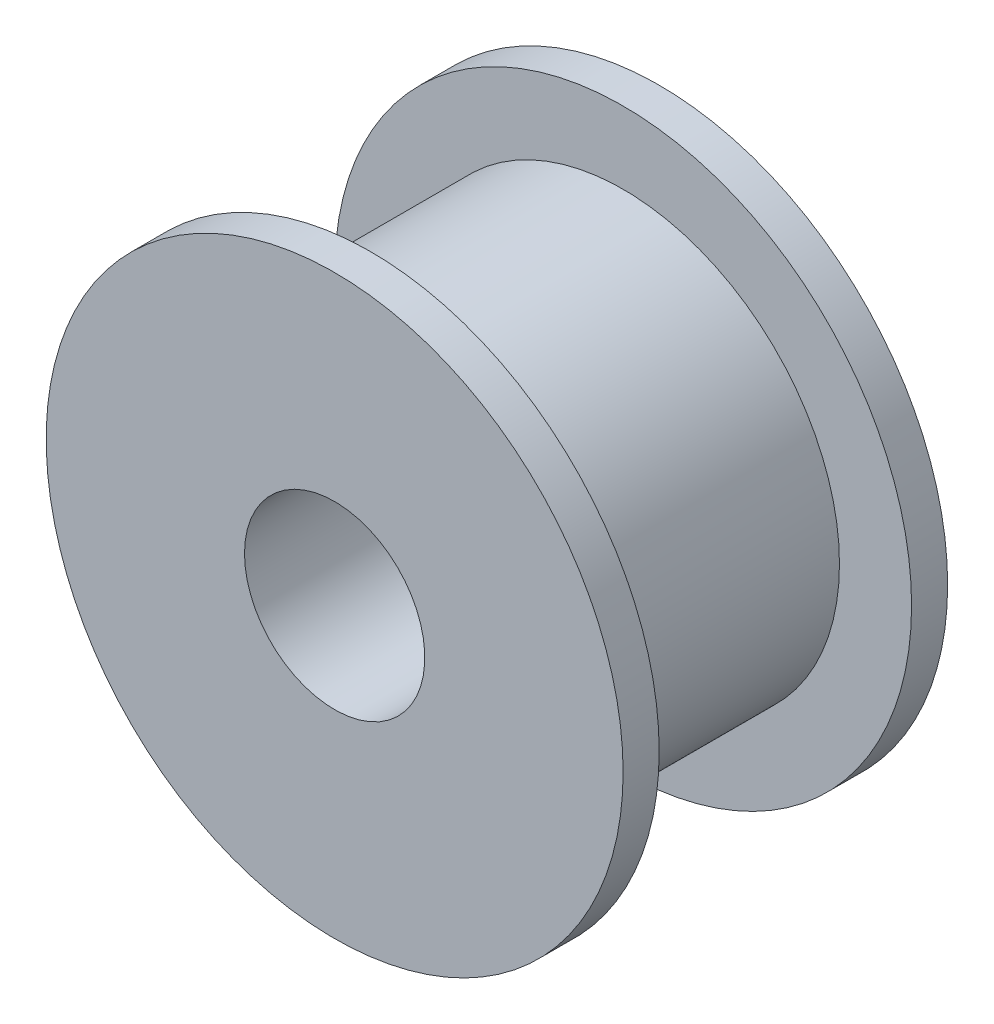
ISO-10303-21;
HEADER;
FILE_DESCRIPTION(('STEP AP214'),'2;1');
FILE_NAME('part.step','',(''),(''),'','','');
FILE_SCHEMA(('AUTOMOTIVE_DESIGN { 1 0 10303 214 1 1 1 1 }'));
ENDSEC;
DATA;
#1=APPLICATION_CONTEXT('core data for automotive mechanical design processes');
#2=APPLICATION_PROTOCOL_DEFINITION('international standard','automotive_design',2000,#1);
#3=PRODUCT_CONTEXT('',#1,'mechanical');
#4=PRODUCT('Part','Part','',(#3));
#5=PRODUCT_RELATED_PRODUCT_CATEGORY('part','',(#4));
#6=PRODUCT_DEFINITION_FORMATION('','',#4);
#7=PRODUCT_DEFINITION_CONTEXT('part definition',#1,'design');
#8=PRODUCT_DEFINITION('design','',#6,#7);
#9=PRODUCT_DEFINITION_SHAPE('','',#8);
#10=(LENGTH_UNIT() NAMED_UNIT(*) SI_UNIT(.MILLI.,.METRE.));
#11=(NAMED_UNIT(*) PLANE_ANGLE_UNIT() SI_UNIT($,.RADIAN.));
#12=(NAMED_UNIT(*) SI_UNIT($,.STERADIAN.) SOLID_ANGLE_UNIT());
#13=UNCERTAINTY_MEASURE_WITH_UNIT(LENGTH_MEASURE(1.E-05),#10,'distance_accuracy_value','');
#14=(GEOMETRIC_REPRESENTATION_CONTEXT(3) GLOBAL_UNCERTAINTY_ASSIGNED_CONTEXT((#13)) GLOBAL_UNIT_ASSIGNED_CONTEXT((#10,
#11,#12)) REPRESENTATION_CONTEXT('',''));
#15=CARTESIAN_POINT('',(0.,0.,0.));
#16=DIRECTION('',(0.,0.,1.));
#17=DIRECTION('',(1.,0.,0.));
#18=AXIS2_PLACEMENT_3D('',#15,#16,#17);
#19=CARTESIAN_POINT('',(0.,0.,4.5));
#20=DIRECTION('',(0.,0.,-1.));
#21=DIRECTION('',(-1.,0.,0.));
#22=AXIS2_PLACEMENT_3D('',#19,#20,#21);
#23=CYLINDRICAL_SURFACE('',#22,8.);
#24=CARTESIAN_POINT('',(0.,0.,-4.5));
#25=DIRECTION('',(0.,0.,1.));
#26=DIRECTION('',(1.,0.,0.));
#27=AXIS2_PLACEMENT_3D('',#24,#25,#26);
#28=CIRCLE('',#27,8.);
#29=CARTESIAN_POINT('',(8.,0.,-4.5));
#30=VERTEX_POINT('',#29);
#31=EDGE_CURVE('E41',#30,#30,#28,.T.);
#32=ORIENTED_EDGE('',*,*,#31,.T.);
#33=EDGE_LOOP('',(#32));
#34=FACE_BOUND('',#33,.T.);
#35=CARTESIAN_POINT('',(0.,0.,-3.5));
#36=DIRECTION('',(0.,0.,1.));
#37=DIRECTION('',(1.,0.,0.));
#38=AXIS2_PLACEMENT_3D('',#35,#36,#37);
#39=CIRCLE('',#38,8.);
#40=CARTESIAN_POINT('',(8.,0.,-3.5));
#41=VERTEX_POINT('',#40);
#42=EDGE_CURVE('E56',#41,#41,#39,.T.);
#43=ORIENTED_EDGE('',*,*,#42,.F.);
#44=EDGE_LOOP('',(#43));
#45=FACE_BOUND('',#44,.T.);
#46=ADVANCED_FACE('F37',(#34,#45),#23,.T.);
#47=CARTESIAN_POINT('',(0.,0.,3.5));
#48=DIRECTION('',(0.,0.,1.));
#49=DIRECTION('',(1.,0.,0.));
#50=AXIS2_PLACEMENT_3D('',#47,#48,#49);
#51=CIRCLE('',#50,8.);
#52=CARTESIAN_POINT('',(8.,0.,3.5));
#53=VERTEX_POINT('',#52);
#54=EDGE_CURVE('E60',#53,#53,#51,.T.);
#55=ORIENTED_EDGE('',*,*,#54,.T.);
#56=EDGE_LOOP('',(#55));
#57=FACE_BOUND('',#56,.T.);
#58=CARTESIAN_POINT('',(0.,0.,4.5));
#59=DIRECTION('',(0.,0.,1.));
#60=DIRECTION('',(1.,0.,0.));
#61=AXIS2_PLACEMENT_3D('',#58,#59,#60);
#62=CIRCLE('',#61,8.);
#63=CARTESIAN_POINT('',(8.,0.,4.5));
#64=VERTEX_POINT('',#63);
#65=EDGE_CURVE('E10',#64,#64,#62,.T.);
#66=ORIENTED_EDGE('',*,*,#65,.F.);
#67=EDGE_LOOP('',(#66));
#68=FACE_BOUND('',#67,.T.);
#69=ADVANCED_FACE('F39',(#57,#68),#23,.T.);
#70=CARTESIAN_POINT('',(0.,0.,4.5));
#71=DIRECTION('',(0.,0.,1.));
#72=DIRECTION('',(1.,0.,0.));
#73=AXIS2_PLACEMENT_3D('',#70,#71,#72);
#74=PLANE('',#73);
#75=CARTESIAN_POINT('',(0.,0.,4.5));
#76=DIRECTION('',(0.,0.,-1.));
#77=DIRECTION('',(-1.,0.,0.));
#78=AXIS2_PLACEMENT_3D('',#75,#76,#77);
#79=CIRCLE('',#78,2.5);
#80=CARTESIAN_POINT('',(-2.5,0.,4.5));
#81=VERTEX_POINT('',#80);
#82=EDGE_CURVE('E50',#81,#81,#79,.T.);
#83=ORIENTED_EDGE('',*,*,#82,.T.);
#84=EDGE_LOOP('',(#83));
#85=FACE_BOUND('',#84,.T.);
#86=ORIENTED_EDGE('',*,*,#65,.T.);
#87=EDGE_LOOP('',(#86));
#88=FACE_BOUND('',#87,.T.);
#89=ADVANCED_FACE('F92',(#85,#88),#74,.T.);
#90=CARTESIAN_POINT('',(0.,0.,-4.5));
#91=DIRECTION('',(0.,0.,1.));
#92=DIRECTION('',(1.,0.,0.));
#93=AXIS2_PLACEMENT_3D('',#90,#91,#92);
#94=PLANE('',#93);
#95=CARTESIAN_POINT('',(0.,0.,-4.5));
#96=DIRECTION('',(0.,0.,-1.));
#97=DIRECTION('',(-1.,0.,0.));
#98=AXIS2_PLACEMENT_3D('',#95,#96,#97);
#99=CIRCLE('',#98,2.5);
#100=CARTESIAN_POINT('',(-2.5,0.,-4.5));
#101=VERTEX_POINT('',#100);
#102=EDGE_CURVE('E52',#101,#101,#99,.T.);
#103=ORIENTED_EDGE('',*,*,#102,.F.);
#104=EDGE_LOOP('',(#103));
#105=FACE_BOUND('',#104,.T.);
#106=ORIENTED_EDGE('',*,*,#31,.F.);
#107=EDGE_LOOP('',(#106));
#108=FACE_BOUND('',#107,.T.);
#109=ADVANCED_FACE('F96',(#105,#108),#94,.F.);
#110=CARTESIAN_POINT('',(0.,0.,4.5));
#111=DIRECTION('',(0.,0.,-1.));
#112=DIRECTION('',(-1.,0.,0.));
#113=AXIS2_PLACEMENT_3D('',#110,#111,#112);
#114=CYLINDRICAL_SURFACE('',#113,2.5);
#115=ORIENTED_EDGE('',*,*,#82,.F.);
#116=EDGE_LOOP('',(#115));
#117=FACE_BOUND('',#116,.T.);
#118=ORIENTED_EDGE('',*,*,#102,.T.);
#119=EDGE_LOOP('',(#118));
#120=FACE_BOUND('',#119,.T.);
#121=ADVANCED_FACE('F83',(#117,#120),#114,.F.);
#122=CARTESIAN_POINT('',(0.,0.,-3.5));
#123=DIRECTION('',(0.,0.,1.));
#124=DIRECTION('',(1.,0.,0.));
#125=AXIS2_PLACEMENT_3D('',#122,#123,#124);
#126=PLANE('',#125);
#127=CARTESIAN_POINT('',(0.,0.,-3.5));
#128=DIRECTION('',(0.,0.,1.));
#129=DIRECTION('',(1.,0.,0.));
#130=AXIS2_PLACEMENT_3D('',#127,#128,#129);
#131=CIRCLE('',#130,6.);
#132=CARTESIAN_POINT('',(6.,0.,-3.5));
#133=VERTEX_POINT('',#132);
#134=EDGE_CURVE('E64',#133,#133,#131,.T.);
#135=ORIENTED_EDGE('',*,*,#134,.F.);
#136=EDGE_LOOP('',(#135));
#137=FACE_BOUND('',#136,.T.);
#138=ORIENTED_EDGE('',*,*,#42,.T.);
#139=EDGE_LOOP('',(#138));
#140=FACE_BOUND('',#139,.T.);
#141=ADVANCED_FACE('F79',(#137,#140),#126,.T.);
#142=CARTESIAN_POINT('',(0.,0.,3.5));
#143=DIRECTION('',(0.,0.,1.));
#144=DIRECTION('',(1.,0.,0.));
#145=AXIS2_PLACEMENT_3D('',#142,#143,#144);
#146=PLANE('',#145);
#147=CARTESIAN_POINT('',(0.,0.,3.5));
#148=DIRECTION('',(0.,0.,1.));
#149=DIRECTION('',(1.,0.,0.));
#150=AXIS2_PLACEMENT_3D('',#147,#148,#149);
#151=CIRCLE('',#150,6.);
#152=CARTESIAN_POINT('',(6.,0.,3.5));
#153=VERTEX_POINT('',#152);
#154=EDGE_CURVE('E68',#153,#153,#151,.T.);
#155=ORIENTED_EDGE('',*,*,#154,.T.);
#156=EDGE_LOOP('',(#155));
#157=FACE_BOUND('',#156,.T.);
#158=ORIENTED_EDGE('',*,*,#54,.F.);
#159=EDGE_LOOP('',(#158));
#160=FACE_BOUND('',#159,.T.);
#161=ADVANCED_FACE('F82',(#157,#160),#146,.F.);
#162=CARTESIAN_POINT('',(0.,0.,-3.5));
#163=DIRECTION('',(0.,0.,1.));
#164=DIRECTION('',(1.,0.,0.));
#165=AXIS2_PLACEMENT_3D('',#162,#163,#164);
#166=CYLINDRICAL_SURFACE('',#165,6.);
#167=ORIENTED_EDGE('',*,*,#134,.T.);
#168=EDGE_LOOP('',(#167));
#169=FACE_BOUND('',#168,.T.);
#170=ORIENTED_EDGE('',*,*,#154,.F.);
#171=EDGE_LOOP('',(#170));
#172=FACE_BOUND('',#171,.T.);
#173=ADVANCED_FACE('F76',(#169,#172),#166,.T.);
#174=CLOSED_SHELL('',(#46,#69,#89,#109,#121,#141,#161,#173));
#175=MANIFOLD_SOLID_BREP('B2',#174);
#176=ADVANCED_BREP_SHAPE_REPRESENTATION('',(#18,#175),#14);
#177=SHAPE_DEFINITION_REPRESENTATION(#9,#176);
ENDSEC;
END-ISO-10303-21;
